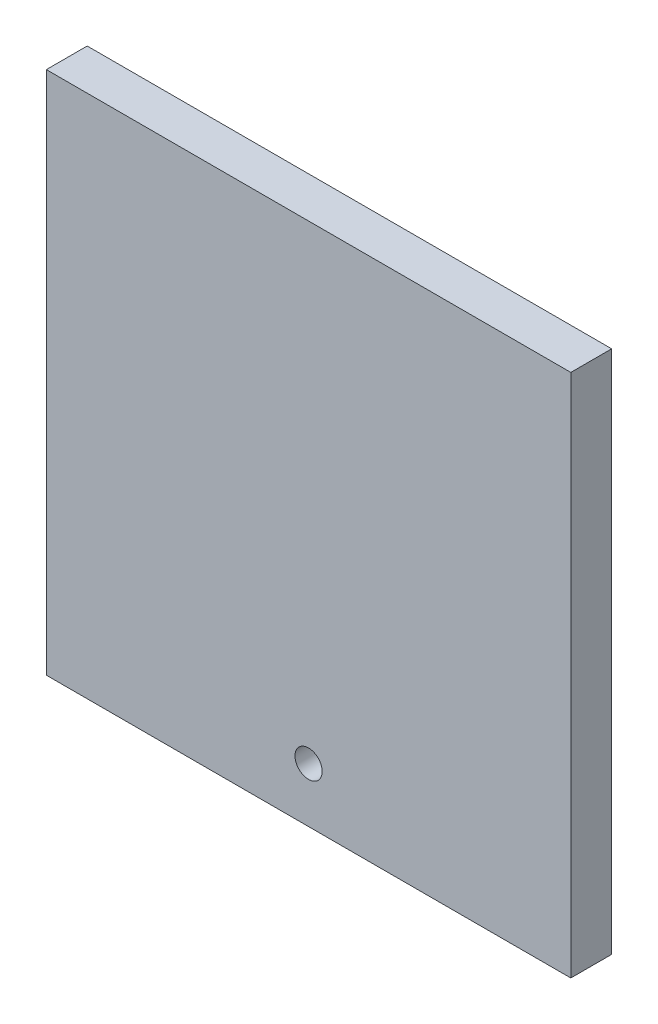
ISO-10303-21;
HEADER;
FILE_DESCRIPTION(('STEP AP214'),'2;1');
FILE_NAME('part.step','',(''),(''),'','','');
FILE_SCHEMA(('AUTOMOTIVE_DESIGN { 1 0 10303 214 1 1 1 1 }'));
ENDSEC;
DATA;
#1=APPLICATION_CONTEXT('core data for automotive mechanical design processes');
#2=APPLICATION_PROTOCOL_DEFINITION('international standard','automotive_design',2000,#1);
#3=PRODUCT_CONTEXT('',#1,'mechanical');
#4=PRODUCT('Part','Part','',(#3));
#5=PRODUCT_RELATED_PRODUCT_CATEGORY('part','',(#4));
#6=PRODUCT_DEFINITION_FORMATION('','',#4);
#7=PRODUCT_DEFINITION_CONTEXT('part definition',#1,'design');
#8=PRODUCT_DEFINITION('design','',#6,#7);
#9=PRODUCT_DEFINITION_SHAPE('','',#8);
#10=(LENGTH_UNIT() NAMED_UNIT(*) SI_UNIT(.MILLI.,.METRE.));
#11=(NAMED_UNIT(*) PLANE_ANGLE_UNIT() SI_UNIT($,.RADIAN.));
#12=(NAMED_UNIT(*) SI_UNIT($,.STERADIAN.) SOLID_ANGLE_UNIT());
#13=UNCERTAINTY_MEASURE_WITH_UNIT(LENGTH_MEASURE(1.E-05),#10,'distance_accuracy_value','');
#14=(GEOMETRIC_REPRESENTATION_CONTEXT(3) GLOBAL_UNCERTAINTY_ASSIGNED_CONTEXT((#13)) GLOBAL_UNIT_ASSIGNED_CONTEXT((#10,
#11,#12)) REPRESENTATION_CONTEXT('',''));
#15=CARTESIAN_POINT('',(0.,0.,0.));
#16=DIRECTION('',(0.,0.,1.));
#17=DIRECTION('',(1.,0.,0.));
#18=AXIS2_PLACEMENT_3D('',#15,#16,#17);
#19=CARTESIAN_POINT('',(38.5,-38.5,6.));
#20=DIRECTION('',(-1.,0.,0.));
#21=DIRECTION('',(0.,0.,1.));
#22=AXIS2_PLACEMENT_3D('',#19,#20,#21);
#23=PLANE('',#22);
#24=DIRECTION('',(0.,1.,0.));
#25=VECTOR('',#24,1.);
#26=CARTESIAN_POINT('',(38.5,-38.5,0.));
#27=LINE('',#26,#25);
#28=CARTESIAN_POINT('',(38.5,-38.5,0.));
#29=VERTEX_POINT('',#28);
#30=CARTESIAN_POINT('',(38.5,38.5,0.));
#31=VERTEX_POINT('',#30);
#32=EDGE_CURVE('E103',#29,#31,#27,.T.);
#33=ORIENTED_EDGE('',*,*,#32,.T.);
#34=DIRECTION('',(0.,0.,-1.));
#35=VECTOR('',#34,1.);
#36=CARTESIAN_POINT('',(38.5,38.5,6.));
#37=LINE('',#36,#35);
#38=CARTESIAN_POINT('',(38.5,38.5,6.));
#39=VERTEX_POINT('',#38);
#40=EDGE_CURVE('E11',#39,#31,#37,.T.);
#41=ORIENTED_EDGE('',*,*,#40,.F.);
#42=DIRECTION('',(0.,1.,0.));
#43=VECTOR('',#42,1.);
#44=CARTESIAN_POINT('',(38.5,-38.5,6.));
#45=LINE('',#44,#43);
#46=CARTESIAN_POINT('',(38.5,-38.5,6.));
#47=VERTEX_POINT('',#46);
#48=EDGE_CURVE('E88',#47,#39,#45,.T.);
#49=ORIENTED_EDGE('',*,*,#48,.F.);
#50=DIRECTION('',(0.,0.,-1.));
#51=VECTOR('',#50,1.);
#52=CARTESIAN_POINT('',(38.5,-38.5,6.));
#53=LINE('',#52,#51);
#54=EDGE_CURVE('E99',#47,#29,#53,.T.);
#55=ORIENTED_EDGE('',*,*,#54,.T.);
#56=EDGE_LOOP('',(#33,#41,#49,#55));
#57=FACE_BOUND('',#56,.T.);
#58=ADVANCED_FACE('F37',(#57),#23,.F.);
#59=CARTESIAN_POINT('',(-38.5,38.5,6.));
#60=DIRECTION('',(0.,-1.,0.));
#61=DIRECTION('',(0.,0.,-1.));
#62=AXIS2_PLACEMENT_3D('',#59,#60,#61);
#63=PLANE('',#62);
#64=DIRECTION('',(-1.,0.,0.));
#65=VECTOR('',#64,1.);
#66=CARTESIAN_POINT('',(-38.5,38.5,0.));
#67=LINE('',#66,#65);
#68=CARTESIAN_POINT('',(-38.5,38.5,0.));
#69=VERTEX_POINT('',#68);
#70=EDGE_CURVE('E93',#31,#69,#67,.T.);
#71=ORIENTED_EDGE('',*,*,#70,.T.);
#72=DIRECTION('',(0.,0.,-1.));
#73=VECTOR('',#72,1.);
#74=CARTESIAN_POINT('',(-38.5,38.5,6.));
#75=LINE('',#74,#73);
#76=CARTESIAN_POINT('',(-38.5,38.5,6.));
#77=VERTEX_POINT('',#76);
#78=EDGE_CURVE('E45',#77,#69,#75,.T.);
#79=ORIENTED_EDGE('',*,*,#78,.F.);
#80=DIRECTION('',(-1.,0.,0.));
#81=VECTOR('',#80,1.);
#82=CARTESIAN_POINT('',(-38.5,38.5,6.));
#83=LINE('',#82,#81);
#84=EDGE_CURVE('E83',#39,#77,#83,.T.);
#85=ORIENTED_EDGE('',*,*,#84,.F.);
#86=ORIENTED_EDGE('',*,*,#40,.T.);
#87=EDGE_LOOP('',(#71,#79,#85,#86));
#88=FACE_BOUND('',#87,.T.);
#89=ADVANCED_FACE('F92',(#88),#63,.F.);
#90=CARTESIAN_POINT('',(-38.5,-38.5,6.));
#91=DIRECTION('',(1.,0.,0.));
#92=DIRECTION('',(0.,0.,-1.));
#93=AXIS2_PLACEMENT_3D('',#90,#91,#92);
#94=PLANE('',#93);
#95=DIRECTION('',(0.,-1.,0.));
#96=VECTOR('',#95,1.);
#97=CARTESIAN_POINT('',(-38.5,-38.5,0.));
#98=LINE('',#97,#96);
#99=CARTESIAN_POINT('',(-38.5,-38.5,0.));
#100=VERTEX_POINT('',#99);
#101=EDGE_CURVE('E70',#69,#100,#98,.T.);
#102=ORIENTED_EDGE('',*,*,#101,.T.);
#103=DIRECTION('',(0.,0.,-1.));
#104=VECTOR('',#103,1.);
#105=CARTESIAN_POINT('',(-38.5,-38.5,6.));
#106=LINE('',#105,#104);
#107=CARTESIAN_POINT('',(-38.5,-38.5,6.));
#108=VERTEX_POINT('',#107);
#109=EDGE_CURVE('E94',#108,#100,#106,.T.);
#110=ORIENTED_EDGE('',*,*,#109,.F.);
#111=DIRECTION('',(0.,-1.,0.));
#112=VECTOR('',#111,1.);
#113=CARTESIAN_POINT('',(-38.5,-38.5,6.));
#114=LINE('',#113,#112);
#115=EDGE_CURVE('E86',#77,#108,#114,.T.);
#116=ORIENTED_EDGE('',*,*,#115,.F.);
#117=ORIENTED_EDGE('',*,*,#78,.T.);
#118=EDGE_LOOP('',(#102,#110,#116,#117));
#119=FACE_BOUND('',#118,.T.);
#120=ADVANCED_FACE('F95',(#119),#94,.F.);
#121=CARTESIAN_POINT('',(-38.5,-38.5,6.));
#122=DIRECTION('',(0.,1.,0.));
#123=DIRECTION('',(0.,0.,1.));
#124=AXIS2_PLACEMENT_3D('',#121,#122,#123);
#125=PLANE('',#124);
#126=DIRECTION('',(1.,0.,0.));
#127=VECTOR('',#126,1.);
#128=CARTESIAN_POINT('',(-38.5,-38.5,0.));
#129=LINE('',#128,#127);
#130=EDGE_CURVE('E76',#100,#29,#129,.T.);
#131=ORIENTED_EDGE('',*,*,#130,.T.);
#132=ORIENTED_EDGE('',*,*,#54,.F.);
#133=DIRECTION('',(1.,0.,0.));
#134=VECTOR('',#133,1.);
#135=CARTESIAN_POINT('',(-38.5,-38.5,6.));
#136=LINE('',#135,#134);
#137=EDGE_CURVE('E53',#108,#47,#136,.T.);
#138=ORIENTED_EDGE('',*,*,#137,.F.);
#139=ORIENTED_EDGE('',*,*,#109,.T.);
#140=EDGE_LOOP('',(#131,#132,#138,#139));
#141=FACE_BOUND('',#140,.T.);
#142=ADVANCED_FACE('F112',(#141),#125,.F.);
#143=CARTESIAN_POINT('',(0.,0.,6.));
#144=DIRECTION('',(0.,0.,-1.));
#145=DIRECTION('',(-1.,0.,0.));
#146=AXIS2_PLACEMENT_3D('',#143,#144,#145);
#147=PLANE('',#146);
#148=CARTESIAN_POINT('',(0.,-30.5,6.));
#149=DIRECTION('',(0.,0.,-1.));
#150=DIRECTION('',(-1.,0.,0.));
#151=AXIS2_PLACEMENT_3D('',#148,#149,#150);
#152=CIRCLE('',#151,2.);
#153=CARTESIAN_POINT('',(-2.,-30.5,6.));
#154=VERTEX_POINT('',#153);
#155=EDGE_CURVE('E106',#154,#154,#152,.T.);
#156=ORIENTED_EDGE('',*,*,#155,.T.);
#157=EDGE_LOOP('',(#156));
#158=FACE_BOUND('',#157,.T.);
#159=ORIENTED_EDGE('',*,*,#48,.T.);
#160=ORIENTED_EDGE('',*,*,#84,.T.);
#161=ORIENTED_EDGE('',*,*,#115,.T.);
#162=ORIENTED_EDGE('',*,*,#137,.T.);
#163=EDGE_LOOP('',(#159,#160,#161,#162));
#164=FACE_BOUND('',#163,.T.);
#165=ADVANCED_FACE('F84',(#158,#164),#147,.F.);
#166=CARTESIAN_POINT('',(0.,0.,0.));
#167=DIRECTION('',(0.,0.,-1.));
#168=DIRECTION('',(-1.,0.,0.));
#169=AXIS2_PLACEMENT_3D('',#166,#167,#168);
#170=PLANE('',#169);
#171=CARTESIAN_POINT('',(0.,-30.5,0.));
#172=DIRECTION('',(0.,0.,-1.));
#173=DIRECTION('',(-1.,0.,0.));
#174=AXIS2_PLACEMENT_3D('',#171,#172,#173);
#175=CIRCLE('',#174,2.);
#176=CARTESIAN_POINT('',(-2.,-30.5,0.));
#177=VERTEX_POINT('',#176);
#178=EDGE_CURVE('E118',#177,#177,#175,.T.);
#179=ORIENTED_EDGE('',*,*,#178,.F.);
#180=EDGE_LOOP('',(#179));
#181=FACE_BOUND('',#180,.T.);
#182=ORIENTED_EDGE('',*,*,#32,.F.);
#183=ORIENTED_EDGE('',*,*,#130,.F.);
#184=ORIENTED_EDGE('',*,*,#101,.F.);
#185=ORIENTED_EDGE('',*,*,#70,.F.);
#186=EDGE_LOOP('',(#182,#183,#184,#185));
#187=FACE_BOUND('',#186,.T.);
#188=ADVANCED_FACE('F115',(#181,#187),#170,.T.);
#189=CARTESIAN_POINT('',(0.,-30.5,6.));
#190=DIRECTION('',(0.,0.,-1.));
#191=DIRECTION('',(-1.,0.,0.));
#192=AXIS2_PLACEMENT_3D('',#189,#190,#191);
#193=CYLINDRICAL_SURFACE('',#192,2.);
#194=ORIENTED_EDGE('',*,*,#155,.F.);
#195=EDGE_LOOP('',(#194));
#196=FACE_BOUND('',#195,.T.);
#197=ORIENTED_EDGE('',*,*,#178,.T.);
#198=EDGE_LOOP('',(#197));
#199=FACE_BOUND('',#198,.T.);
#200=ADVANCED_FACE('F125',(#196,#199),#193,.F.);
#201=CLOSED_SHELL('',(#58,#89,#120,#142,#165,#188,#200));
#202=MANIFOLD_SOLID_BREP('B2',#201);
#203=ADVANCED_BREP_SHAPE_REPRESENTATION('',(#18,#202),#14);
#204=SHAPE_DEFINITION_REPRESENTATION(#9,#203);
ENDSEC;
END-ISO-10303-21;
